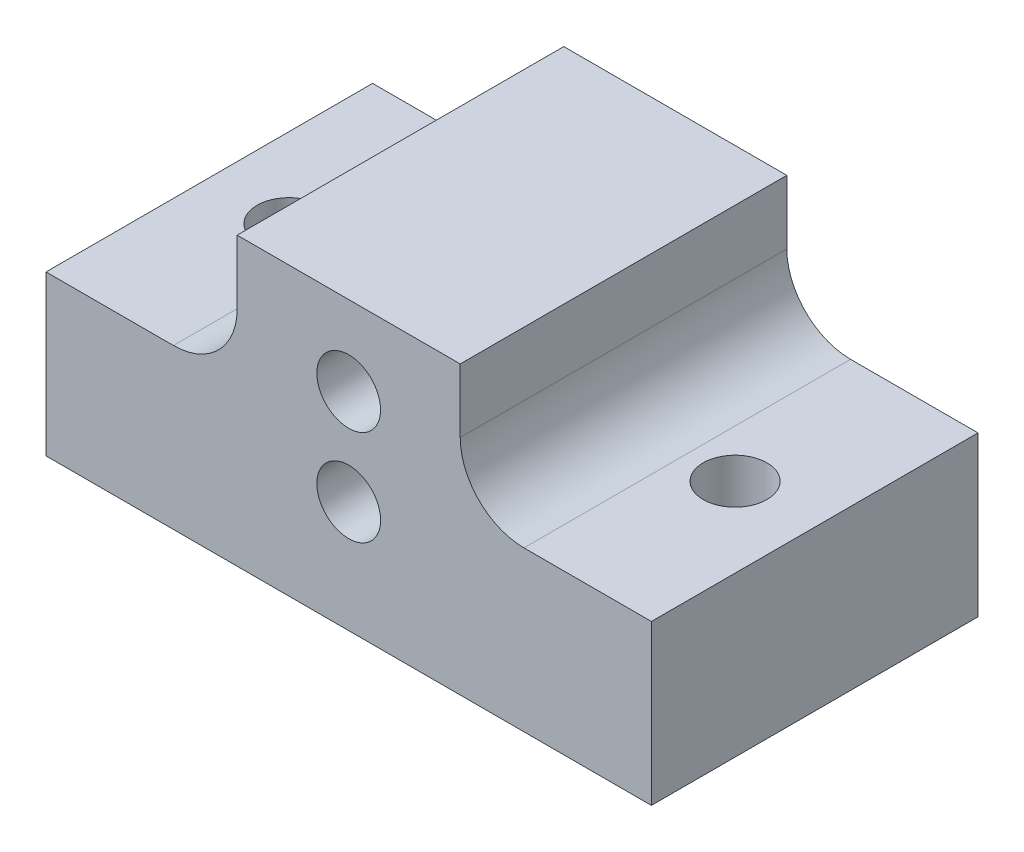
ISO-10303-21;
HEADER;
FILE_DESCRIPTION(('STEP AP214'),'2;1');
FILE_NAME('part.step','',(''),(''),'','','');
FILE_SCHEMA(('AUTOMOTIVE_DESIGN { 1 0 10303 214 1 1 1 1 }'));
ENDSEC;
DATA;
#1=APPLICATION_CONTEXT('core data for automotive mechanical design processes');
#2=APPLICATION_PROTOCOL_DEFINITION('international standard','automotive_design',2000,#1);
#3=PRODUCT_CONTEXT('',#1,'mechanical');
#4=PRODUCT('Part','Part','',(#3));
#5=PRODUCT_RELATED_PRODUCT_CATEGORY('part','',(#4));
#6=PRODUCT_DEFINITION_FORMATION('','',#4);
#7=PRODUCT_DEFINITION_CONTEXT('part definition',#1,'design');
#8=PRODUCT_DEFINITION('design','',#6,#7);
#9=PRODUCT_DEFINITION_SHAPE('','',#8);
#10=(LENGTH_UNIT() NAMED_UNIT(*) SI_UNIT(.MILLI.,.METRE.));
#11=(NAMED_UNIT(*) PLANE_ANGLE_UNIT() SI_UNIT($,.RADIAN.));
#12=(NAMED_UNIT(*) SI_UNIT($,.STERADIAN.) SOLID_ANGLE_UNIT());
#13=UNCERTAINTY_MEASURE_WITH_UNIT(LENGTH_MEASURE(1.E-05),#10,'distance_accuracy_value','');
#14=(GEOMETRIC_REPRESENTATION_CONTEXT(3) GLOBAL_UNCERTAINTY_ASSIGNED_CONTEXT((#13)) GLOBAL_UNIT_ASSIGNED_CONTEXT((#10,
#11,#12)) REPRESENTATION_CONTEXT('',''));
#15=CARTESIAN_POINT('',(0.,0.,0.));
#16=DIRECTION('',(0.,0.,1.));
#17=DIRECTION('',(1.,0.,0.));
#18=AXIS2_PLACEMENT_3D('',#15,#16,#17);
#19=CARTESIAN_POINT('',(-0.750000000000034,14.,10.25));
#20=DIRECTION('',(0.,0.,-1.));
#21=DIRECTION('',(-1.,0.,0.));
#22=AXIS2_PLACEMENT_3D('',#19,#20,#21);
#23=PLANE('',#22);
#24=DIRECTION('',(0.,-1.,0.));
#25=VECTOR('',#24,1.);
#26=CARTESIAN_POINT('',(3.24999999999996,18.,10.25));
#27=LINE('',#26,#25);
#28=CARTESIAN_POINT('',(3.24999999999996,18.,10.25));
#29=VERTEX_POINT('',#28);
#30=CARTESIAN_POINT('',(3.24999999999997,14.,10.25));
#31=VERTEX_POINT('',#30);
#32=EDGE_CURVE('E164',#29,#31,#27,.T.);
#33=ORIENTED_EDGE('',*,*,#32,.T.);
#34=CARTESIAN_POINT('',(-0.750000000000034,14.,10.25));
#35=DIRECTION('',(0.,0.,-1.));
#36=DIRECTION('',(-1.,0.,0.));
#37=AXIS2_PLACEMENT_3D('',#34,#35,#36);
#38=CIRCLE('',#37,4.);
#39=CARTESIAN_POINT('',(-0.750000000000034,10.,10.25));
#40=VERTEX_POINT('',#39);
#41=EDGE_CURVE('E101',#31,#40,#38,.T.);
#42=ORIENTED_EDGE('',*,*,#41,.T.);
#43=DIRECTION('',(-1.,0.,0.));
#44=VECTOR('',#43,1.);
#45=CARTESIAN_POINT('',(-8.75000000000004,10.,10.2499999999999));
#46=LINE('',#45,#44);
#47=CARTESIAN_POINT('',(-8.75000000000004,10.,10.2499999999999));
#48=VERTEX_POINT('',#47);
#49=EDGE_CURVE('E186',#40,#48,#46,.T.);
#50=ORIENTED_EDGE('',*,*,#49,.T.);
#51=DIRECTION('',(0.,-1.,0.));
#52=VECTOR('',#51,1.);
#53=CARTESIAN_POINT('',(-8.75000000000004,10.,10.2499999999999));
#54=LINE('',#53,#52);
#55=CARTESIAN_POINT('',(-8.75000000000004,0.,10.2499999999999));
#56=VERTEX_POINT('',#55);
#57=EDGE_CURVE('E204',#48,#56,#54,.T.);
#58=ORIENTED_EDGE('',*,*,#57,.T.);
#59=DIRECTION('',(1.,0.,0.));
#60=VECTOR('',#59,1.);
#61=CARTESIAN_POINT('',(-8.75000000000004,0.,10.2499999999999));
#62=LINE('',#61,#60);
#63=CARTESIAN_POINT('',(29.25,0.,10.2500000000001));
#64=VERTEX_POINT('',#63);
#65=EDGE_CURVE('E201',#56,#64,#62,.T.);
#66=ORIENTED_EDGE('',*,*,#65,.T.);
#67=DIRECTION('',(0.,1.,0.));
#68=VECTOR('',#67,1.);
#69=CARTESIAN_POINT('',(29.25,10.,10.2500000000001));
#70=LINE('',#69,#68);
#71=CARTESIAN_POINT('',(29.25,10.,10.2500000000001));
#72=VERTEX_POINT('',#71);
#73=EDGE_CURVE('E203',#64,#72,#70,.T.);
#74=ORIENTED_EDGE('',*,*,#73,.T.);
#75=DIRECTION('',(-1.,0.,0.));
#76=VECTOR('',#75,1.);
#77=CARTESIAN_POINT('',(21.25,10.,10.25));
#78=LINE('',#77,#76);
#79=CARTESIAN_POINT('',(21.25,10.,10.25));
#80=VERTEX_POINT('',#79);
#81=EDGE_CURVE('E126',#72,#80,#78,.T.);
#82=ORIENTED_EDGE('',*,*,#81,.T.);
#83=CARTESIAN_POINT('',(21.25,14.,10.25));
#84=DIRECTION('',(0.,0.,-1.));
#85=DIRECTION('',(-1.,0.,0.));
#86=AXIS2_PLACEMENT_3D('',#83,#84,#85);
#87=CIRCLE('',#86,4.);
#88=CARTESIAN_POINT('',(17.25,14.,10.25));
#89=VERTEX_POINT('',#88);
#90=EDGE_CURVE('E120',#80,#89,#87,.T.);
#91=ORIENTED_EDGE('',*,*,#90,.T.);
#92=DIRECTION('',(0.,1.,0.));
#93=VECTOR('',#92,1.);
#94=CARTESIAN_POINT('',(17.25,18.,10.25));
#95=LINE('',#94,#93);
#96=CARTESIAN_POINT('',(17.25,18.,10.25));
#97=VERTEX_POINT('',#96);
#98=EDGE_CURVE('E124',#89,#97,#95,.T.);
#99=ORIENTED_EDGE('',*,*,#98,.T.);
#100=DIRECTION('',(-1.,0.,0.));
#101=VECTOR('',#100,1.);
#102=CARTESIAN_POINT('',(3.24999999999996,18.,10.25));
#103=LINE('',#102,#101);
#104=EDGE_CURVE('E52',#97,#29,#103,.T.);
#105=ORIENTED_EDGE('',*,*,#104,.T.);
#106=EDGE_LOOP('',(#33,#42,#50,#58,#66,#74,#82,#91,#99,#105));
#107=FACE_BOUND('',#106,.T.);
#108=CARTESIAN_POINT('',(10.25,13.,10.25));
#109=DIRECTION('',(0.,0.,1.));
#110=DIRECTION('',(1.,0.,0.));
#111=AXIS2_PLACEMENT_3D('',#108,#109,#110);
#112=CIRCLE('',#111,2.);
#113=CARTESIAN_POINT('',(12.25,13.,10.25));
#114=VERTEX_POINT('',#113);
#115=EDGE_CURVE('E148',#114,#114,#112,.T.);
#116=ORIENTED_EDGE('',*,*,#115,.F.);
#117=EDGE_LOOP('',(#116));
#118=FACE_BOUND('',#117,.T.);
#119=CARTESIAN_POINT('',(10.25,7.,10.25));
#120=DIRECTION('',(0.,0.,1.));
#121=DIRECTION('',(1.,0.,0.));
#122=AXIS2_PLACEMENT_3D('',#119,#120,#121);
#123=CIRCLE('',#122,2.);
#124=CARTESIAN_POINT('',(12.25,7.,10.25));
#125=VERTEX_POINT('',#124);
#126=EDGE_CURVE('E215',#125,#125,#123,.T.);
#127=ORIENTED_EDGE('',*,*,#126,.F.);
#128=EDGE_LOOP('',(#127));
#129=FACE_BOUND('',#128,.T.);
#130=ADVANCED_FACE('F34',(#107,#118,#129),#23,.F.);
#131=CARTESIAN_POINT('',(-0.749999999999962,14.,-10.25));
#132=DIRECTION('',(0.,0.,-1.));
#133=DIRECTION('',(-1.,0.,0.));
#134=AXIS2_PLACEMENT_3D('',#131,#132,#133);
#135=PLANE('',#134);
#136=CARTESIAN_POINT('',(10.25,13.,-10.25));
#137=DIRECTION('',(0.,0.,1.));
#138=DIRECTION('',(1.,0.,0.));
#139=AXIS2_PLACEMENT_3D('',#136,#137,#138);
#140=CIRCLE('',#139,2.);
#141=CARTESIAN_POINT('',(12.25,13.,-10.25));
#142=VERTEX_POINT('',#141);
#143=EDGE_CURVE('E212',#142,#142,#140,.T.);
#144=ORIENTED_EDGE('',*,*,#143,.T.);
#145=EDGE_LOOP('',(#144));
#146=FACE_BOUND('',#145,.T.);
#147=DIRECTION('',(0.,-1.,0.));
#148=VECTOR('',#147,1.);
#149=CARTESIAN_POINT('',(3.25000000000004,18.,-10.25));
#150=LINE('',#149,#148);
#151=CARTESIAN_POINT('',(3.25000000000004,18.,-10.25));
#152=VERTEX_POINT('',#151);
#153=CARTESIAN_POINT('',(3.25000000000004,14.,-10.25));
#154=VERTEX_POINT('',#153);
#155=EDGE_CURVE('E144',#152,#154,#150,.T.);
#156=ORIENTED_EDGE('',*,*,#155,.F.);
#157=DIRECTION('',(-1.,0.,0.));
#158=VECTOR('',#157,1.);
#159=CARTESIAN_POINT('',(3.25000000000004,18.,-10.25));
#160=LINE('',#159,#158);
#161=CARTESIAN_POINT('',(17.25,18.,-10.25));
#162=VERTEX_POINT('',#161);
#163=EDGE_CURVE('E93',#162,#152,#160,.T.);
#164=ORIENTED_EDGE('',*,*,#163,.F.);
#165=DIRECTION('',(0.,1.,0.));
#166=VECTOR('',#165,1.);
#167=CARTESIAN_POINT('',(17.25,18.,-10.25));
#168=LINE('',#167,#166);
#169=CARTESIAN_POINT('',(17.25,14.,-10.25));
#170=VERTEX_POINT('',#169);
#171=EDGE_CURVE('E87',#170,#162,#168,.T.);
#172=ORIENTED_EDGE('',*,*,#171,.F.);
#173=CARTESIAN_POINT('',(21.25,14.,-10.25));
#174=DIRECTION('',(0.,0.,-1.));
#175=DIRECTION('',(-1.,0.,0.));
#176=AXIS2_PLACEMENT_3D('',#173,#174,#175);
#177=CIRCLE('',#176,4.);
#178=CARTESIAN_POINT('',(21.25,10.,-10.25));
#179=VERTEX_POINT('',#178);
#180=EDGE_CURVE('E134',#179,#170,#177,.T.);
#181=ORIENTED_EDGE('',*,*,#180,.F.);
#182=DIRECTION('',(-1.,0.,0.));
#183=VECTOR('',#182,1.);
#184=CARTESIAN_POINT('',(21.25,10.,-10.25));
#185=LINE('',#184,#183);
#186=CARTESIAN_POINT('',(29.25,10.,-10.2499999999999));
#187=VERTEX_POINT('',#186);
#188=EDGE_CURVE('E159',#187,#179,#185,.T.);
#189=ORIENTED_EDGE('',*,*,#188,.F.);
#190=DIRECTION('',(0.,1.,0.));
#191=VECTOR('',#190,1.);
#192=CARTESIAN_POINT('',(29.25,10.,-10.2499999999999));
#193=LINE('',#192,#191);
#194=CARTESIAN_POINT('',(29.25,0.,-10.2499999999999));
#195=VERTEX_POINT('',#194);
#196=EDGE_CURVE('E157',#195,#187,#193,.T.);
#197=ORIENTED_EDGE('',*,*,#196,.F.);
#198=DIRECTION('',(1.,0.,0.));
#199=VECTOR('',#198,1.);
#200=CARTESIAN_POINT('',(17.25,0.,-10.25));
#201=LINE('',#200,#199);
#202=CARTESIAN_POINT('',(-8.74999999999996,0.,-10.2500000000001));
#203=VERTEX_POINT('',#202);
#204=EDGE_CURVE('E155',#203,#195,#201,.T.);
#205=ORIENTED_EDGE('',*,*,#204,.F.);
#206=DIRECTION('',(0.,-1.,0.));
#207=VECTOR('',#206,1.);
#208=CARTESIAN_POINT('',(-8.74999999999996,10.,-10.2500000000001));
#209=LINE('',#208,#207);
#210=CARTESIAN_POINT('',(-8.74999999999996,10.,-10.2500000000001));
#211=VERTEX_POINT('',#210);
#212=EDGE_CURVE('E152',#211,#203,#209,.T.);
#213=ORIENTED_EDGE('',*,*,#212,.F.);
#214=DIRECTION('',(-1.,0.,0.));
#215=VECTOR('',#214,1.);
#216=CARTESIAN_POINT('',(-8.74999999999996,10.,-10.2500000000001));
#217=LINE('',#216,#215);
#218=CARTESIAN_POINT('',(-0.749999999999962,10.,-10.25));
#219=VERTEX_POINT('',#218);
#220=EDGE_CURVE('E150',#219,#211,#217,.T.);
#221=ORIENTED_EDGE('',*,*,#220,.F.);
#222=CARTESIAN_POINT('',(-0.749999999999962,14.,-10.25));
#223=DIRECTION('',(0.,0.,-1.));
#224=DIRECTION('',(-1.,0.,0.));
#225=AXIS2_PLACEMENT_3D('',#222,#223,#224);
#226=CIRCLE('',#225,4.);
#227=EDGE_CURVE('E147',#154,#219,#226,.T.);
#228=ORIENTED_EDGE('',*,*,#227,.F.);
#229=EDGE_LOOP('',(#156,#164,#172,#181,#189,#197,#205,#213,#221,#228));
#230=FACE_BOUND('',#229,.T.);
#231=CARTESIAN_POINT('',(10.25,7.,-10.25));
#232=DIRECTION('',(0.,0.,1.));
#233=DIRECTION('',(1.,0.,0.));
#234=AXIS2_PLACEMENT_3D('',#231,#232,#233);
#235=CIRCLE('',#234,2.);
#236=CARTESIAN_POINT('',(12.25,7.,-10.25));
#237=VERTEX_POINT('',#236);
#238=EDGE_CURVE('E218',#237,#237,#235,.T.);
#239=ORIENTED_EDGE('',*,*,#238,.T.);
#240=EDGE_LOOP('',(#239));
#241=FACE_BOUND('',#240,.T.);
#242=ADVANCED_FACE('F190',(#146,#230,#241),#135,.T.);
#243=CARTESIAN_POINT('',(3.24999999999996,18.,10.25));
#244=DIRECTION('',(1.,0.,0.));
#245=DIRECTION('',(0.,1.,0.));
#246=AXIS2_PLACEMENT_3D('',#243,#244,#245);
#247=PLANE('',#246);
#248=ORIENTED_EDGE('',*,*,#155,.T.);
#249=DIRECTION('',(0.,0.,-1.));
#250=VECTOR('',#249,1.);
#251=CARTESIAN_POINT('',(3.24999999999997,14.,10.25));
#252=LINE('',#251,#250);
#253=EDGE_CURVE('E11',#31,#154,#252,.T.);
#254=ORIENTED_EDGE('',*,*,#253,.F.);
#255=ORIENTED_EDGE('',*,*,#32,.F.);
#256=DIRECTION('',(0.,0.,-1.));
#257=VECTOR('',#256,1.);
#258=CARTESIAN_POINT('',(3.24999999999996,18.,10.25));
#259=LINE('',#258,#257);
#260=EDGE_CURVE('E140',#29,#152,#259,.T.);
#261=ORIENTED_EDGE('',*,*,#260,.T.);
#262=EDGE_LOOP('',(#248,#254,#255,#261));
#263=FACE_BOUND('',#262,.T.);
#264=ADVANCED_FACE('F36',(#263),#247,.F.);
#265=CARTESIAN_POINT('',(-0.750000000000034,14.,10.25));
#266=DIRECTION('',(0.,0.,-1.));
#267=DIRECTION('',(-1.,0.,0.));
#268=AXIS2_PLACEMENT_3D('',#265,#266,#267);
#269=CYLINDRICAL_SURFACE('',#268,4.);
#270=ORIENTED_EDGE('',*,*,#227,.T.);
#271=DIRECTION('',(0.,0.,-1.));
#272=VECTOR('',#271,1.);
#273=CARTESIAN_POINT('',(-0.750000000000034,10.,10.25));
#274=LINE('',#273,#272);
#275=EDGE_CURVE('E44',#40,#219,#274,.T.);
#276=ORIENTED_EDGE('',*,*,#275,.F.);
#277=ORIENTED_EDGE('',*,*,#41,.F.);
#278=ORIENTED_EDGE('',*,*,#253,.T.);
#279=EDGE_LOOP('',(#270,#276,#277,#278));
#280=FACE_BOUND('',#279,.T.);
#281=ADVANCED_FACE('F371',(#280),#269,.F.);
#282=CARTESIAN_POINT('',(-8.75000000000004,10.,10.2499999999999));
#283=DIRECTION('',(0.,-1.,0.));
#284=DIRECTION('',(1.,0.,0.));
#285=AXIS2_PLACEMENT_3D('',#282,#283,#284);
#286=PLANE('',#285);
#287=CARTESIAN_POINT('',(-3.75,10.,0.));
#288=DIRECTION('',(0.,1.,0.));
#289=DIRECTION('',(-1.,0.,0.));
#290=AXIS2_PLACEMENT_3D('',#287,#288,#289);
#291=CIRCLE('',#290,2.);
#292=CARTESIAN_POINT('',(-5.75,10.,0.));
#293=VERTEX_POINT('',#292);
#294=EDGE_CURVE('E227',#293,#293,#291,.T.);
#295=ORIENTED_EDGE('',*,*,#294,.F.);
#296=EDGE_LOOP('',(#295));
#297=FACE_BOUND('',#296,.T.);
#298=ORIENTED_EDGE('',*,*,#220,.T.);
#299=DIRECTION('',(0.,0.,-1.));
#300=VECTOR('',#299,1.);
#301=CARTESIAN_POINT('',(-8.75000000000004,10.,10.2499999999999));
#302=LINE('',#301,#300);
#303=EDGE_CURVE('E177',#48,#211,#302,.T.);
#304=ORIENTED_EDGE('',*,*,#303,.F.);
#305=ORIENTED_EDGE('',*,*,#49,.F.);
#306=ORIENTED_EDGE('',*,*,#275,.T.);
#307=EDGE_LOOP('',(#298,#304,#305,#306));
#308=FACE_BOUND('',#307,.T.);
#309=ADVANCED_FACE('F184',(#297,#308),#286,.F.);
#310=CARTESIAN_POINT('',(-8.75000000000004,10.,10.2499999999999));
#311=DIRECTION('',(1.,0.,0.));
#312=DIRECTION('',(0.,0.,-1.));
#313=AXIS2_PLACEMENT_3D('',#310,#311,#312);
#314=PLANE('',#313);
#315=ORIENTED_EDGE('',*,*,#212,.T.);
#316=DIRECTION('',(0.,0.,-1.));
#317=VECTOR('',#316,1.);
#318=CARTESIAN_POINT('',(-8.75000000000004,0.,10.2499999999999));
#319=LINE('',#318,#317);
#320=EDGE_CURVE('E174',#56,#203,#319,.T.);
#321=ORIENTED_EDGE('',*,*,#320,.F.);
#322=ORIENTED_EDGE('',*,*,#57,.F.);
#323=ORIENTED_EDGE('',*,*,#303,.T.);
#324=EDGE_LOOP('',(#315,#321,#322,#323));
#325=FACE_BOUND('',#324,.T.);
#326=ADVANCED_FACE('F195',(#325),#314,.F.);
#327=CARTESIAN_POINT('',(17.25,0.,10.25));
#328=DIRECTION('',(0.,1.,0.));
#329=DIRECTION('',(-1.,0.,0.));
#330=AXIS2_PLACEMENT_3D('',#327,#328,#329);
#331=PLANE('',#330);
#332=CARTESIAN_POINT('',(24.25,0.,0.));
#333=DIRECTION('',(0.,1.,0.));
#334=DIRECTION('',(-1.,0.,0.));
#335=AXIS2_PLACEMENT_3D('',#332,#333,#334);
#336=CIRCLE('',#335,2.);
#337=CARTESIAN_POINT('',(22.25,0.,0.));
#338=VERTEX_POINT('',#337);
#339=EDGE_CURVE('E223',#338,#338,#336,.T.);
#340=ORIENTED_EDGE('',*,*,#339,.T.);
#341=EDGE_LOOP('',(#340));
#342=FACE_BOUND('',#341,.T.);
#343=CARTESIAN_POINT('',(-3.75,0.,0.));
#344=DIRECTION('',(0.,1.,0.));
#345=DIRECTION('',(-1.,0.,0.));
#346=AXIS2_PLACEMENT_3D('',#343,#344,#345);
#347=CIRCLE('',#346,2.);
#348=CARTESIAN_POINT('',(-5.75,0.,0.));
#349=VERTEX_POINT('',#348);
#350=EDGE_CURVE('E38',#349,#349,#347,.T.);
#351=ORIENTED_EDGE('',*,*,#350,.T.);
#352=EDGE_LOOP('',(#351));
#353=FACE_BOUND('',#352,.T.);
#354=ORIENTED_EDGE('',*,*,#204,.T.);
#355=DIRECTION('',(0.,0.,-1.));
#356=VECTOR('',#355,1.);
#357=CARTESIAN_POINT('',(29.25,0.,10.2500000000001));
#358=LINE('',#357,#356);
#359=EDGE_CURVE('E171',#64,#195,#358,.T.);
#360=ORIENTED_EDGE('',*,*,#359,.F.);
#361=ORIENTED_EDGE('',*,*,#65,.F.);
#362=ORIENTED_EDGE('',*,*,#320,.T.);
#363=EDGE_LOOP('',(#354,#360,#361,#362));
#364=FACE_BOUND('',#363,.T.);
#365=ADVANCED_FACE('F199',(#342,#353,#364),#331,.F.);
#366=CARTESIAN_POINT('',(29.25,10.,10.2500000000001));
#367=DIRECTION('',(-1.,0.,0.));
#368=DIRECTION('',(0.,0.,1.));
#369=AXIS2_PLACEMENT_3D('',#366,#367,#368);
#370=PLANE('',#369);
#371=ORIENTED_EDGE('',*,*,#196,.T.);
#372=DIRECTION('',(0.,0.,-1.));
#373=VECTOR('',#372,1.);
#374=CARTESIAN_POINT('',(29.25,10.,10.2500000000001));
#375=LINE('',#374,#373);
#376=EDGE_CURVE('E168',#72,#187,#375,.T.);
#377=ORIENTED_EDGE('',*,*,#376,.F.);
#378=ORIENTED_EDGE('',*,*,#73,.F.);
#379=ORIENTED_EDGE('',*,*,#359,.T.);
#380=EDGE_LOOP('',(#371,#377,#378,#379));
#381=FACE_BOUND('',#380,.T.);
#382=ADVANCED_FACE('F239',(#381),#370,.F.);
#383=CARTESIAN_POINT('',(21.25,10.,10.25));
#384=DIRECTION('',(0.,-1.,0.));
#385=DIRECTION('',(1.,0.,0.));
#386=AXIS2_PLACEMENT_3D('',#383,#384,#385);
#387=PLANE('',#386);
#388=CARTESIAN_POINT('',(24.25,10.,0.));
#389=DIRECTION('',(0.,1.,0.));
#390=DIRECTION('',(-1.,0.,0.));
#391=AXIS2_PLACEMENT_3D('',#388,#389,#390);
#392=CIRCLE('',#391,2.);
#393=CARTESIAN_POINT('',(22.25,10.,0.));
#394=VERTEX_POINT('',#393);
#395=EDGE_CURVE('E226',#394,#394,#392,.T.);
#396=ORIENTED_EDGE('',*,*,#395,.F.);
#397=EDGE_LOOP('',(#396));
#398=FACE_BOUND('',#397,.T.);
#399=ORIENTED_EDGE('',*,*,#188,.T.);
#400=DIRECTION('',(0.,0.,-1.));
#401=VECTOR('',#400,1.);
#402=CARTESIAN_POINT('',(21.25,10.,10.25));
#403=LINE('',#402,#401);
#404=EDGE_CURVE('E135',#80,#179,#403,.T.);
#405=ORIENTED_EDGE('',*,*,#404,.F.);
#406=ORIENTED_EDGE('',*,*,#81,.F.);
#407=ORIENTED_EDGE('',*,*,#376,.T.);
#408=EDGE_LOOP('',(#399,#405,#406,#407));
#409=FACE_BOUND('',#408,.T.);
#410=ADVANCED_FACE('F236',(#398,#409),#387,.F.);
#411=CARTESIAN_POINT('',(21.25,14.,10.25));
#412=DIRECTION('',(0.,0.,-1.));
#413=DIRECTION('',(-1.,0.,0.));
#414=AXIS2_PLACEMENT_3D('',#411,#412,#413);
#415=CYLINDRICAL_SURFACE('',#414,4.);
#416=ORIENTED_EDGE('',*,*,#180,.T.);
#417=DIRECTION('',(0.,0.,-1.));
#418=VECTOR('',#417,1.);
#419=CARTESIAN_POINT('',(17.25,14.,10.25));
#420=LINE('',#419,#418);
#421=EDGE_CURVE('E131',#89,#170,#420,.T.);
#422=ORIENTED_EDGE('',*,*,#421,.F.);
#423=ORIENTED_EDGE('',*,*,#90,.F.);
#424=ORIENTED_EDGE('',*,*,#404,.T.);
#425=EDGE_LOOP('',(#416,#422,#423,#424));
#426=FACE_BOUND('',#425,.T.);
#427=ADVANCED_FACE('F132',(#426),#415,.F.);
#428=CARTESIAN_POINT('',(17.25,18.,10.25));
#429=DIRECTION('',(-1.,0.,0.));
#430=DIRECTION('',(0.,0.,1.));
#431=AXIS2_PLACEMENT_3D('',#428,#429,#430);
#432=PLANE('',#431);
#433=ORIENTED_EDGE('',*,*,#171,.T.);
#434=DIRECTION('',(0.,0.,-1.));
#435=VECTOR('',#434,1.);
#436=CARTESIAN_POINT('',(17.25,18.,10.25));
#437=LINE('',#436,#435);
#438=EDGE_CURVE('E136',#97,#162,#437,.T.);
#439=ORIENTED_EDGE('',*,*,#438,.F.);
#440=ORIENTED_EDGE('',*,*,#98,.F.);
#441=ORIENTED_EDGE('',*,*,#421,.T.);
#442=EDGE_LOOP('',(#433,#439,#440,#441));
#443=FACE_BOUND('',#442,.T.);
#444=ADVANCED_FACE('F138',(#443),#432,.F.);
#445=CARTESIAN_POINT('',(3.24999999999996,18.,10.25));
#446=DIRECTION('',(0.,-1.,0.));
#447=DIRECTION('',(1.,0.,0.));
#448=AXIS2_PLACEMENT_3D('',#445,#446,#447);
#449=PLANE('',#448);
#450=ORIENTED_EDGE('',*,*,#163,.T.);
#451=ORIENTED_EDGE('',*,*,#260,.F.);
#452=ORIENTED_EDGE('',*,*,#104,.F.);
#453=ORIENTED_EDGE('',*,*,#438,.T.);
#454=EDGE_LOOP('',(#450,#451,#452,#453));
#455=FACE_BOUND('',#454,.T.);
#456=ADVANCED_FACE('F246',(#455),#449,.F.);
#457=CARTESIAN_POINT('',(10.25,13.,10.25));
#458=DIRECTION('',(0.,0.,-1.));
#459=DIRECTION('',(-1.,0.,0.));
#460=AXIS2_PLACEMENT_3D('',#457,#458,#459);
#461=CYLINDRICAL_SURFACE('',#460,2.);
#462=ORIENTED_EDGE('',*,*,#115,.T.);
#463=EDGE_LOOP('',(#462));
#464=FACE_BOUND('',#463,.T.);
#465=ORIENTED_EDGE('',*,*,#143,.F.);
#466=EDGE_LOOP('',(#465));
#467=FACE_BOUND('',#466,.T.);
#468=ADVANCED_FACE('F248',(#464,#467),#461,.F.);
#469=CARTESIAN_POINT('',(10.25,7.,10.25));
#470=DIRECTION('',(0.,0.,-1.));
#471=DIRECTION('',(-1.,0.,0.));
#472=AXIS2_PLACEMENT_3D('',#469,#470,#471);
#473=CYLINDRICAL_SURFACE('',#472,2.);
#474=ORIENTED_EDGE('',*,*,#126,.T.);
#475=EDGE_LOOP('',(#474));
#476=FACE_BOUND('',#475,.T.);
#477=ORIENTED_EDGE('',*,*,#238,.F.);
#478=EDGE_LOOP('',(#477));
#479=FACE_BOUND('',#478,.T.);
#480=ADVANCED_FACE('F254',(#476,#479),#473,.F.);
#481=CARTESIAN_POINT('',(24.25,-10.5,0.));
#482=DIRECTION('',(0.,1.,0.));
#483=DIRECTION('',(-1.,0.,0.));
#484=AXIS2_PLACEMENT_3D('',#481,#482,#483);
#485=CYLINDRICAL_SURFACE('',#484,2.);
#486=ORIENTED_EDGE('',*,*,#395,.T.);
#487=EDGE_LOOP('',(#486));
#488=FACE_BOUND('',#487,.T.);
#489=ORIENTED_EDGE('',*,*,#339,.F.);
#490=EDGE_LOOP('',(#489));
#491=FACE_BOUND('',#490,.T.);
#492=ADVANCED_FACE('F233',(#488,#491),#485,.F.);
#493=CARTESIAN_POINT('',(-3.75,-10.5,0.));
#494=DIRECTION('',(0.,1.,0.));
#495=DIRECTION('',(-1.,0.,0.));
#496=AXIS2_PLACEMENT_3D('',#493,#494,#495);
#497=CYLINDRICAL_SURFACE('',#496,2.);
#498=ORIENTED_EDGE('',*,*,#294,.T.);
#499=EDGE_LOOP('',(#498));
#500=FACE_BOUND('',#499,.T.);
#501=ORIENTED_EDGE('',*,*,#350,.F.);
#502=EDGE_LOOP('',(#501));
#503=FACE_BOUND('',#502,.T.);
#504=ADVANCED_FACE('F269',(#500,#503),#497,.F.);
#505=CLOSED_SHELL('',(#130,#242,#264,#281,#309,#326,#365,#382,#410,#427,#444,#456,#468,#480,
#492,#504));
#506=MANIFOLD_SOLID_BREP('B2',#505);
#507=ADVANCED_BREP_SHAPE_REPRESENTATION('',(#18,#506),#14);
#508=SHAPE_DEFINITION_REPRESENTATION(#9,#507);
ENDSEC;
END-ISO-10303-21;
